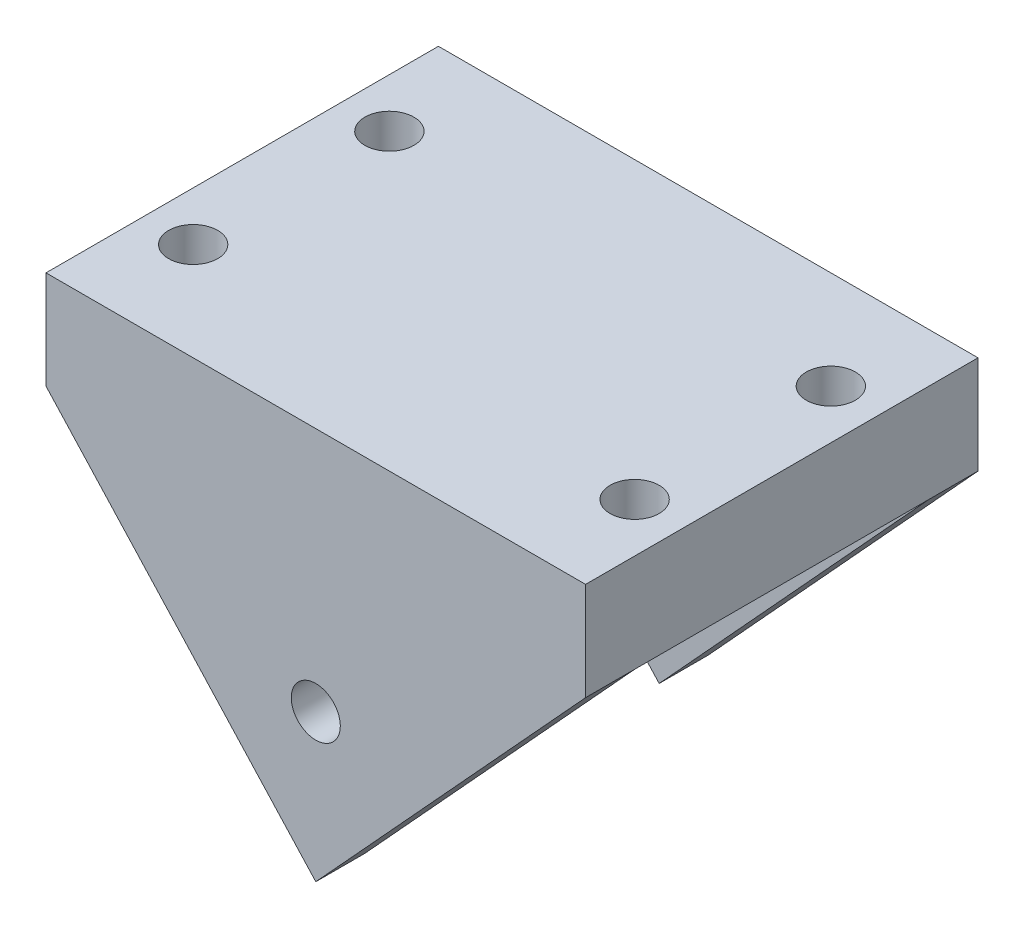
ISO-10303-21;
HEADER;
FILE_DESCRIPTION(('STEP AP214'),'2;1');
FILE_NAME('part.step','',(''),(''),'','','');
FILE_SCHEMA(('AUTOMOTIVE_DESIGN { 1 0 10303 214 1 1 1 1 }'));
ENDSEC;
DATA;
#1=APPLICATION_CONTEXT('core data for automotive mechanical design processes');
#2=APPLICATION_PROTOCOL_DEFINITION('international standard','automotive_design',2000,#1);
#3=PRODUCT_CONTEXT('',#1,'mechanical');
#4=PRODUCT('Part','Part','',(#3));
#5=PRODUCT_RELATED_PRODUCT_CATEGORY('part','',(#4));
#6=PRODUCT_DEFINITION_FORMATION('','',#4);
#7=PRODUCT_DEFINITION_CONTEXT('part definition',#1,'design');
#8=PRODUCT_DEFINITION('design','',#6,#7);
#9=PRODUCT_DEFINITION_SHAPE('','',#8);
#10=(LENGTH_UNIT() NAMED_UNIT(*) SI_UNIT(.MILLI.,.METRE.));
#11=(NAMED_UNIT(*) PLANE_ANGLE_UNIT() SI_UNIT($,.RADIAN.));
#12=(NAMED_UNIT(*) SI_UNIT($,.STERADIAN.) SOLID_ANGLE_UNIT());
#13=UNCERTAINTY_MEASURE_WITH_UNIT(LENGTH_MEASURE(1.E-05),#10,'distance_accuracy_value','');
#14=(GEOMETRIC_REPRESENTATION_CONTEXT(3) GLOBAL_UNCERTAINTY_ASSIGNED_CONTEXT((#13)) GLOBAL_UNIT_ASSIGNED_CONTEXT((#10,
#11,#12)) REPRESENTATION_CONTEXT('',''));
#15=CARTESIAN_POINT('',(0.,0.,0.));
#16=DIRECTION('',(0.,0.,1.));
#17=DIRECTION('',(1.,0.,0.));
#18=AXIS2_PLACEMENT_3D('',#15,#16,#17);
#19=CARTESIAN_POINT('',(55.,20.,-30.));
#20=DIRECTION('',(-1.,0.,0.));
#21=DIRECTION('',(0.,0.,1.));
#22=AXIS2_PLACEMENT_3D('',#19,#20,#21);
#23=PLANE('',#22);
#24=DIRECTION('',(0.,0.,-1.));
#25=VECTOR('',#24,1.);
#26=CARTESIAN_POINT('',(55.,0.,-30.));
#27=LINE('',#26,#25);
#28=CARTESIAN_POINT('',(55.,0.,30.));
#29=VERTEX_POINT('',#28);
#30=CARTESIAN_POINT('',(55.,0.,-30.));
#31=VERTEX_POINT('',#30);
#32=EDGE_CURVE('E228',#29,#31,#27,.T.);
#33=ORIENTED_EDGE('',*,*,#32,.T.);
#34=DIRECTION('',(0.,0.,1.));
#35=VECTOR('',#34,1.);
#36=CARTESIAN_POINT('',(55.,0.,-40.));
#37=LINE('',#36,#35);
#38=CARTESIAN_POINT('',(55.,0.,-40.));
#39=VERTEX_POINT('',#38);
#40=EDGE_CURVE('E161',#39,#31,#37,.T.);
#41=ORIENTED_EDGE('',*,*,#40,.F.);
#42=DIRECTION('',(0.,1.,0.));
#43=VECTOR('',#42,1.);
#44=CARTESIAN_POINT('',(55.,20.,-40.));
#45=LINE('',#44,#43);
#46=CARTESIAN_POINT('',(55.,20.,-40.));
#47=VERTEX_POINT('',#46);
#48=EDGE_CURVE('E135',#39,#47,#45,.T.);
#49=ORIENTED_EDGE('',*,*,#48,.T.);
#50=DIRECTION('',(0.,0.,-1.));
#51=VECTOR('',#50,1.);
#52=CARTESIAN_POINT('',(55.,20.,-30.));
#53=LINE('',#52,#51);
#54=CARTESIAN_POINT('',(55.,20.,40.));
#55=VERTEX_POINT('',#54);
#56=EDGE_CURVE('E54',#55,#47,#53,.T.);
#57=ORIENTED_EDGE('',*,*,#56,.F.);
#58=DIRECTION('',(0.,1.,0.));
#59=VECTOR('',#58,1.);
#60=CARTESIAN_POINT('',(55.,20.,40.));
#61=LINE('',#60,#59);
#62=CARTESIAN_POINT('',(55.,0.,40.));
#63=VERTEX_POINT('',#62);
#64=EDGE_CURVE('E175',#63,#55,#61,.T.);
#65=ORIENTED_EDGE('',*,*,#64,.F.);
#66=DIRECTION('',(0.,0.,-1.));
#67=VECTOR('',#66,1.);
#68=CARTESIAN_POINT('',(55.,0.,40.));
#69=LINE('',#68,#67);
#70=EDGE_CURVE('E182',#63,#29,#69,.T.);
#71=ORIENTED_EDGE('',*,*,#70,.T.);
#72=EDGE_LOOP('',(#33,#41,#49,#57,#65,#71));
#73=FACE_BOUND('',#72,.T.);
#74=ADVANCED_FACE('F45',(#73),#23,.F.);
#75=CARTESIAN_POINT('',(-55.,20.,-30.));
#76=DIRECTION('',(1.,0.,0.));
#77=DIRECTION('',(0.,0.,-1.));
#78=AXIS2_PLACEMENT_3D('',#75,#76,#77);
#79=PLANE('',#78);
#80=DIRECTION('',(0.,0.,1.));
#81=VECTOR('',#80,1.);
#82=CARTESIAN_POINT('',(-55.,0.,-30.));
#83=LINE('',#82,#81);
#84=CARTESIAN_POINT('',(-55.,0.,-30.));
#85=VERTEX_POINT('',#84);
#86=CARTESIAN_POINT('',(-55.,0.,30.));
#87=VERTEX_POINT('',#86);
#88=EDGE_CURVE('E62',#85,#87,#83,.T.);
#89=ORIENTED_EDGE('',*,*,#88,.T.);
#90=DIRECTION('',(0.,0.,-1.));
#91=VECTOR('',#90,1.);
#92=CARTESIAN_POINT('',(-55.,0.,40.));
#93=LINE('',#92,#91);
#94=CARTESIAN_POINT('',(-55.,0.,40.));
#95=VERTEX_POINT('',#94);
#96=EDGE_CURVE('E195',#95,#87,#93,.T.);
#97=ORIENTED_EDGE('',*,*,#96,.F.);
#98=DIRECTION('',(0.,-1.,0.));
#99=VECTOR('',#98,1.);
#100=CARTESIAN_POINT('',(-55.,0.,40.));
#101=LINE('',#100,#99);
#102=CARTESIAN_POINT('',(-55.,20.,40.));
#103=VERTEX_POINT('',#102);
#104=EDGE_CURVE('E116',#103,#95,#101,.T.);
#105=ORIENTED_EDGE('',*,*,#104,.F.);
#106=DIRECTION('',(0.,0.,1.));
#107=VECTOR('',#106,1.);
#108=CARTESIAN_POINT('',(-55.,20.,-30.));
#109=LINE('',#108,#107);
#110=CARTESIAN_POINT('',(-55.,20.,-40.));
#111=VERTEX_POINT('',#110);
#112=EDGE_CURVE('E11',#111,#103,#109,.T.);
#113=ORIENTED_EDGE('',*,*,#112,.F.);
#114=DIRECTION('',(0.,-1.,0.));
#115=VECTOR('',#114,1.);
#116=CARTESIAN_POINT('',(-55.,0.,-40.));
#117=LINE('',#116,#115);
#118=CARTESIAN_POINT('',(-55.,0.,-40.));
#119=VERTEX_POINT('',#118);
#120=EDGE_CURVE('E113',#111,#119,#117,.T.);
#121=ORIENTED_EDGE('',*,*,#120,.T.);
#122=DIRECTION('',(0.,0.,1.));
#123=VECTOR('',#122,1.);
#124=CARTESIAN_POINT('',(-55.,0.,-40.));
#125=LINE('',#124,#123);
#126=EDGE_CURVE('E147',#119,#85,#125,.T.);
#127=ORIENTED_EDGE('',*,*,#126,.T.);
#128=EDGE_LOOP('',(#89,#97,#105,#113,#121,#127));
#129=FACE_BOUND('',#128,.T.);
#130=ADVANCED_FACE('F112',(#129),#79,.F.);
#131=CARTESIAN_POINT('',(0.,20.,0.));
#132=DIRECTION('',(0.,1.,0.));
#133=DIRECTION('',(0.,0.,1.));
#134=AXIS2_PLACEMENT_3D('',#131,#132,#133);
#135=PLANE('',#134);
#136=CARTESIAN_POINT('',(-45.,20.,20.));
#137=DIRECTION('',(0.,1.,0.));
#138=DIRECTION('',(0.,0.,1.));
#139=AXIS2_PLACEMENT_3D('',#136,#137,#138);
#140=CIRCLE('',#139,5.);
#141=CARTESIAN_POINT('',(-45.,20.,25.));
#142=VERTEX_POINT('',#141);
#143=EDGE_CURVE('E217',#142,#142,#140,.T.);
#144=ORIENTED_EDGE('',*,*,#143,.F.);
#145=EDGE_LOOP('',(#144));
#146=FACE_BOUND('',#145,.T.);
#147=CARTESIAN_POINT('',(45.,20.,20.));
#148=DIRECTION('',(0.,1.,0.));
#149=DIRECTION('',(0.,0.,1.));
#150=AXIS2_PLACEMENT_3D('',#147,#148,#149);
#151=CIRCLE('',#150,5.);
#152=CARTESIAN_POINT('',(45.,20.,25.));
#153=VERTEX_POINT('',#152);
#154=EDGE_CURVE('E209',#153,#153,#151,.T.);
#155=ORIENTED_EDGE('',*,*,#154,.F.);
#156=EDGE_LOOP('',(#155));
#157=FACE_BOUND('',#156,.T.);
#158=CARTESIAN_POINT('',(45.,20.,-20.));
#159=DIRECTION('',(0.,1.,0.));
#160=DIRECTION('',(0.,0.,1.));
#161=AXIS2_PLACEMENT_3D('',#158,#159,#160);
#162=CIRCLE('',#161,5.);
#163=CARTESIAN_POINT('',(45.,20.,-15.));
#164=VERTEX_POINT('',#163);
#165=EDGE_CURVE('E200',#164,#164,#162,.T.);
#166=ORIENTED_EDGE('',*,*,#165,.F.);
#167=EDGE_LOOP('',(#166));
#168=FACE_BOUND('',#167,.T.);
#169=CARTESIAN_POINT('',(-45.,20.,-20.));
#170=DIRECTION('',(0.,1.,0.));
#171=DIRECTION('',(0.,0.,1.));
#172=AXIS2_PLACEMENT_3D('',#169,#170,#171);
#173=CIRCLE('',#172,5.);
#174=CARTESIAN_POINT('',(-45.,20.,-15.));
#175=VERTEX_POINT('',#174);
#176=EDGE_CURVE('E204',#175,#175,#173,.T.);
#177=ORIENTED_EDGE('',*,*,#176,.F.);
#178=EDGE_LOOP('',(#177));
#179=FACE_BOUND('',#178,.T.);
#180=ORIENTED_EDGE('',*,*,#56,.T.);
#181=DIRECTION('',(-1.,0.,0.));
#182=VECTOR('',#181,1.);
#183=CARTESIAN_POINT('',(-55.,20.,-40.));
#184=LINE('',#183,#182);
#185=EDGE_CURVE('E125',#47,#111,#184,.T.);
#186=ORIENTED_EDGE('',*,*,#185,.T.);
#187=ORIENTED_EDGE('',*,*,#112,.T.);
#188=DIRECTION('',(-1.,0.,0.));
#189=VECTOR('',#188,1.);
#190=CARTESIAN_POINT('',(-55.,20.,40.));
#191=LINE('',#190,#189);
#192=EDGE_CURVE('E179',#55,#103,#191,.T.);
#193=ORIENTED_EDGE('',*,*,#192,.F.);
#194=EDGE_LOOP('',(#180,#186,#187,#193));
#195=FACE_BOUND('',#194,.T.);
#196=ADVANCED_FACE('F133',(#146,#157,#168,#179,#195),#135,.T.);
#197=CARTESIAN_POINT('',(0.,0.,0.));
#198=DIRECTION('',(0.,1.,0.));
#199=DIRECTION('',(0.,0.,1.));
#200=AXIS2_PLACEMENT_3D('',#197,#198,#199);
#201=PLANE('',#200);
#202=ORIENTED_EDGE('',*,*,#32,.F.);
#203=DIRECTION('',(1.,0.,0.));
#204=VECTOR('',#203,1.);
#205=CARTESIAN_POINT('',(-55.,0.,30.));
#206=LINE('',#205,#204);
#207=EDGE_CURVE('E233',#87,#29,#206,.T.);
#208=ORIENTED_EDGE('',*,*,#207,.F.);
#209=ORIENTED_EDGE('',*,*,#88,.F.);
#210=DIRECTION('',(-1.,0.,0.));
#211=VECTOR('',#210,1.);
#212=CARTESIAN_POINT('',(-55.,0.,-30.));
#213=LINE('',#212,#211);
#214=EDGE_CURVE('E69',#31,#85,#213,.T.);
#215=ORIENTED_EDGE('',*,*,#214,.F.);
#216=EDGE_LOOP('',(#202,#208,#209,#215));
#217=FACE_BOUND('',#216,.T.);
#218=ADVANCED_FACE('F276',(#217),#201,.F.);
#219=CARTESIAN_POINT('',(-45.,10.,-20.));
#220=DIRECTION('',(0.,1.,0.));
#221=DIRECTION('',(0.,0.,1.));
#222=AXIS2_PLACEMENT_3D('',#219,#220,#221);
#223=CYLINDRICAL_SURFACE('',#222,5.);
#224=CARTESIAN_POINT('',(-45.,10.,-20.));
#225=DIRECTION('',(0.,1.,0.));
#226=DIRECTION('',(0.,0.,1.));
#227=AXIS2_PLACEMENT_3D('',#224,#225,#226);
#228=CIRCLE('',#227,5.);
#229=CARTESIAN_POINT('',(-45.,10.,-15.));
#230=VERTEX_POINT('',#229);
#231=EDGE_CURVE('E224',#230,#230,#228,.T.);
#232=ORIENTED_EDGE('',*,*,#231,.F.);
#233=EDGE_LOOP('',(#232));
#234=FACE_BOUND('',#233,.T.);
#235=ORIENTED_EDGE('',*,*,#176,.T.);
#236=EDGE_LOOP('',(#235));
#237=FACE_BOUND('',#236,.T.);
#238=ADVANCED_FACE('F281',(#234,#237),#223,.F.);
#239=CARTESIAN_POINT('',(-45.,10.,-20.));
#240=DIRECTION('',(0.,1.,0.));
#241=DIRECTION('',(0.,0.,1.));
#242=AXIS2_PLACEMENT_3D('',#239,#240,#241);
#243=PLANE('',#242);
#244=ORIENTED_EDGE('',*,*,#231,.T.);
#245=EDGE_LOOP('',(#244));
#246=FACE_BOUND('',#245,.T.);
#247=ADVANCED_FACE('F285',(#246),#243,.T.);
#248=CARTESIAN_POINT('',(45.,10.,-20.));
#249=DIRECTION('',(0.,1.,0.));
#250=DIRECTION('',(0.,0.,1.));
#251=AXIS2_PLACEMENT_3D('',#248,#249,#250);
#252=CYLINDRICAL_SURFACE('',#251,5.);
#253=CARTESIAN_POINT('',(45.,10.,-20.));
#254=DIRECTION('',(0.,1.,0.));
#255=DIRECTION('',(0.,0.,1.));
#256=AXIS2_PLACEMENT_3D('',#253,#254,#255);
#257=CIRCLE('',#256,5.);
#258=CARTESIAN_POINT('',(45.,10.,-15.));
#259=VERTEX_POINT('',#258);
#260=EDGE_CURVE('E205',#259,#259,#257,.T.);
#261=ORIENTED_EDGE('',*,*,#260,.F.);
#262=EDGE_LOOP('',(#261));
#263=FACE_BOUND('',#262,.T.);
#264=ORIENTED_EDGE('',*,*,#165,.T.);
#265=EDGE_LOOP('',(#264));
#266=FACE_BOUND('',#265,.T.);
#267=ADVANCED_FACE('F288',(#263,#266),#252,.F.);
#268=CARTESIAN_POINT('',(45.,10.,-20.));
#269=DIRECTION('',(0.,1.,0.));
#270=DIRECTION('',(0.,0.,1.));
#271=AXIS2_PLACEMENT_3D('',#268,#269,#270);
#272=PLANE('',#271);
#273=ORIENTED_EDGE('',*,*,#260,.T.);
#274=EDGE_LOOP('',(#273));
#275=FACE_BOUND('',#274,.T.);
#276=ADVANCED_FACE('F301',(#275),#272,.T.);
#277=CARTESIAN_POINT('',(45.,10.,20.));
#278=DIRECTION('',(0.,1.,0.));
#279=DIRECTION('',(0.,0.,1.));
#280=AXIS2_PLACEMENT_3D('',#277,#278,#279);
#281=CYLINDRICAL_SURFACE('',#280,5.);
#282=CARTESIAN_POINT('',(45.,10.,20.));
#283=DIRECTION('',(0.,1.,0.));
#284=DIRECTION('',(0.,0.,1.));
#285=AXIS2_PLACEMENT_3D('',#282,#283,#284);
#286=CIRCLE('',#285,5.);
#287=CARTESIAN_POINT('',(45.,10.,25.));
#288=VERTEX_POINT('',#287);
#289=EDGE_CURVE('E213',#288,#288,#286,.T.);
#290=ORIENTED_EDGE('',*,*,#289,.F.);
#291=EDGE_LOOP('',(#290));
#292=FACE_BOUND('',#291,.T.);
#293=ORIENTED_EDGE('',*,*,#154,.T.);
#294=EDGE_LOOP('',(#293));
#295=FACE_BOUND('',#294,.T.);
#296=ADVANCED_FACE('F297',(#292,#295),#281,.F.);
#297=CARTESIAN_POINT('',(45.,10.,20.));
#298=DIRECTION('',(0.,1.,0.));
#299=DIRECTION('',(0.,0.,1.));
#300=AXIS2_PLACEMENT_3D('',#297,#298,#299);
#301=PLANE('',#300);
#302=ORIENTED_EDGE('',*,*,#289,.T.);
#303=EDGE_LOOP('',(#302));
#304=FACE_BOUND('',#303,.T.);
#305=ADVANCED_FACE('F293',(#304),#301,.T.);
#306=CARTESIAN_POINT('',(-45.,10.,20.));
#307=DIRECTION('',(0.,1.,0.));
#308=DIRECTION('',(0.,0.,1.));
#309=AXIS2_PLACEMENT_3D('',#306,#307,#308);
#310=CYLINDRICAL_SURFACE('',#309,5.);
#311=CARTESIAN_POINT('',(-45.,10.,20.));
#312=DIRECTION('',(0.,1.,0.));
#313=DIRECTION('',(0.,0.,1.));
#314=AXIS2_PLACEMENT_3D('',#311,#312,#313);
#315=CIRCLE('',#314,5.);
#316=CARTESIAN_POINT('',(-45.,10.,25.));
#317=VERTEX_POINT('',#316);
#318=EDGE_CURVE('E199',#317,#317,#315,.T.);
#319=ORIENTED_EDGE('',*,*,#318,.F.);
#320=EDGE_LOOP('',(#319));
#321=FACE_BOUND('',#320,.T.);
#322=ORIENTED_EDGE('',*,*,#143,.T.);
#323=EDGE_LOOP('',(#322));
#324=FACE_BOUND('',#323,.T.);
#325=ADVANCED_FACE('F265',(#321,#324),#310,.F.);
#326=CARTESIAN_POINT('',(-45.,10.,20.));
#327=DIRECTION('',(0.,1.,0.));
#328=DIRECTION('',(0.,0.,1.));
#329=AXIS2_PLACEMENT_3D('',#326,#327,#328);
#330=PLANE('',#329);
#331=ORIENTED_EDGE('',*,*,#318,.T.);
#332=EDGE_LOOP('',(#331));
#333=FACE_BOUND('',#332,.T.);
#334=ADVANCED_FACE('F258',(#333),#330,.T.);
#335=CARTESIAN_POINT('',(-55.,0.,40.));
#336=DIRECTION('',(0.737154140200741,0.675724628517346,0.));
#337=DIRECTION('',(-0.675724628517346,0.737154140200741,0.));
#338=AXIS2_PLACEMENT_3D('',#335,#336,#337);
#339=PLANE('',#338);
#340=DIRECTION('',(0.675724628517346,-0.737154140200741,0.));
#341=VECTOR('',#340,1.);
#342=CARTESIAN_POINT('',(-55.,0.,30.));
#343=LINE('',#342,#341);
#344=CARTESIAN_POINT('',(0.,-60.,30.));
#345=VERTEX_POINT('',#344);
#346=EDGE_CURVE('E165',#87,#345,#343,.T.);
#347=ORIENTED_EDGE('',*,*,#346,.T.);
#348=DIRECTION('',(0.,0.,-1.));
#349=VECTOR('',#348,1.);
#350=CARTESIAN_POINT('',(0.,-60.,40.));
#351=LINE('',#350,#349);
#352=CARTESIAN_POINT('',(0.,-60.,40.));
#353=VERTEX_POINT('',#352);
#354=EDGE_CURVE('E191',#353,#345,#351,.T.);
#355=ORIENTED_EDGE('',*,*,#354,.F.);
#356=DIRECTION('',(0.675724628517346,-0.737154140200741,0.));
#357=VECTOR('',#356,1.);
#358=CARTESIAN_POINT('',(-55.,0.,40.));
#359=LINE('',#358,#357);
#360=EDGE_CURVE('E168',#95,#353,#359,.T.);
#361=ORIENTED_EDGE('',*,*,#360,.F.);
#362=ORIENTED_EDGE('',*,*,#96,.T.);
#363=EDGE_LOOP('',(#347,#355,#361,#362));
#364=FACE_BOUND('',#363,.T.);
#365=ADVANCED_FACE('F256',(#364),#339,.F.);
#366=CARTESIAN_POINT('',(0.,-60.,40.));
#367=DIRECTION('',(-0.737154140200741,0.675724628517346,0.));
#368=DIRECTION('',(-0.675724628517346,-0.737154140200741,0.));
#369=AXIS2_PLACEMENT_3D('',#366,#367,#368);
#370=PLANE('',#369);
#371=DIRECTION('',(0.675724628517346,0.737154140200741,0.));
#372=VECTOR('',#371,1.);
#373=CARTESIAN_POINT('',(0.,-60.,30.));
#374=LINE('',#373,#372);
#375=EDGE_CURVE('E169',#345,#29,#374,.T.);
#376=ORIENTED_EDGE('',*,*,#375,.T.);
#377=ORIENTED_EDGE('',*,*,#70,.F.);
#378=DIRECTION('',(0.675724628517346,0.737154140200741,0.));
#379=VECTOR('',#378,1.);
#380=CARTESIAN_POINT('',(0.,-60.,40.));
#381=LINE('',#380,#379);
#382=EDGE_CURVE('E172',#353,#63,#381,.T.);
#383=ORIENTED_EDGE('',*,*,#382,.F.);
#384=ORIENTED_EDGE('',*,*,#354,.T.);
#385=EDGE_LOOP('',(#376,#377,#383,#384));
#386=FACE_BOUND('',#385,.T.);
#387=ADVANCED_FACE('F248',(#386),#370,.F.);
#388=CARTESIAN_POINT('',(0.,0.,40.));
#389=DIRECTION('',(0.,0.,-1.));
#390=DIRECTION('',(-1.,0.,0.));
#391=AXIS2_PLACEMENT_3D('',#388,#389,#390);
#392=PLANE('',#391);
#393=CARTESIAN_POINT('',(0.,-30.,40.));
#394=DIRECTION('',(0.,0.,1.));
#395=DIRECTION('',(1.,0.,0.));
#396=AXIS2_PLACEMENT_3D('',#393,#394,#395);
#397=CIRCLE('',#396,5.);
#398=CARTESIAN_POINT('',(5.,-30.,40.));
#399=VERTEX_POINT('',#398);
#400=EDGE_CURVE('E494',#399,#399,#397,.T.);
#401=ORIENTED_EDGE('',*,*,#400,.F.);
#402=EDGE_LOOP('',(#401));
#403=FACE_BOUND('',#402,.T.);
#404=ORIENTED_EDGE('',*,*,#104,.T.);
#405=ORIENTED_EDGE('',*,*,#360,.T.);
#406=ORIENTED_EDGE('',*,*,#382,.T.);
#407=ORIENTED_EDGE('',*,*,#64,.T.);
#408=ORIENTED_EDGE('',*,*,#192,.T.);
#409=EDGE_LOOP('',(#404,#405,#406,#407,#408));
#410=FACE_BOUND('',#409,.T.);
#411=ADVANCED_FACE('F254',(#403,#410),#392,.F.);
#412=CARTESIAN_POINT('',(0.,0.,30.));
#413=DIRECTION('',(0.,0.,-1.));
#414=DIRECTION('',(-1.,0.,0.));
#415=AXIS2_PLACEMENT_3D('',#412,#413,#414);
#416=PLANE('',#415);
#417=CARTESIAN_POINT('',(0.,-30.,30.));
#418=DIRECTION('',(0.,0.,-1.));
#419=DIRECTION('',(-1.,0.,0.));
#420=AXIS2_PLACEMENT_3D('',#417,#418,#419);
#421=CIRCLE('',#420,5.);
#422=CARTESIAN_POINT('',(-5.,-30.,30.));
#423=VERTEX_POINT('',#422);
#424=EDGE_CURVE('E152',#423,#423,#421,.T.);
#425=ORIENTED_EDGE('',*,*,#424,.F.);
#426=EDGE_LOOP('',(#425));
#427=FACE_BOUND('',#426,.T.);
#428=ORIENTED_EDGE('',*,*,#346,.F.);
#429=ORIENTED_EDGE('',*,*,#207,.T.);
#430=ORIENTED_EDGE('',*,*,#375,.F.);
#431=EDGE_LOOP('',(#428,#429,#430));
#432=FACE_BOUND('',#431,.T.);
#433=ADVANCED_FACE('F245',(#427,#432),#416,.T.);
#434=CARTESIAN_POINT('',(0.,-60.,-40.));
#435=DIRECTION('',(0.737154140200741,-0.675724628517346,0.));
#436=DIRECTION('',(0.675724628517346,0.737154140200741,0.));
#437=AXIS2_PLACEMENT_3D('',#434,#435,#436);
#438=PLANE('',#437);
#439=DIRECTION('',(0.675724628517346,0.737154140200741,0.));
#440=VECTOR('',#439,1.);
#441=CARTESIAN_POINT('',(0.,-60.,-30.));
#442=LINE('',#441,#440);
#443=CARTESIAN_POINT('',(0.,-60.,-30.));
#444=VERTEX_POINT('',#443);
#445=EDGE_CURVE('E148',#444,#31,#442,.T.);
#446=ORIENTED_EDGE('',*,*,#445,.F.);
#447=DIRECTION('',(0.,0.,1.));
#448=VECTOR('',#447,1.);
#449=CARTESIAN_POINT('',(0.,-60.,-40.));
#450=LINE('',#449,#448);
#451=CARTESIAN_POINT('',(0.,-60.,-40.));
#452=VERTEX_POINT('',#451);
#453=EDGE_CURVE('E158',#452,#444,#450,.T.);
#454=ORIENTED_EDGE('',*,*,#453,.F.);
#455=DIRECTION('',(0.675724628517346,0.737154140200741,0.));
#456=VECTOR('',#455,1.);
#457=CARTESIAN_POINT('',(0.,-60.,-40.));
#458=LINE('',#457,#456);
#459=EDGE_CURVE('E138',#452,#39,#458,.T.);
#460=ORIENTED_EDGE('',*,*,#459,.T.);
#461=ORIENTED_EDGE('',*,*,#40,.T.);
#462=EDGE_LOOP('',(#446,#454,#460,#461));
#463=FACE_BOUND('',#462,.T.);
#464=ADVANCED_FACE('F402',(#463),#438,.T.);
#465=CARTESIAN_POINT('',(-55.,0.,-40.));
#466=DIRECTION('',(-0.737154140200741,-0.675724628517346,0.));
#467=DIRECTION('',(0.675724628517346,-0.737154140200741,0.));
#468=AXIS2_PLACEMENT_3D('',#465,#466,#467);
#469=PLANE('',#468);
#470=DIRECTION('',(0.675724628517346,-0.737154140200741,0.));
#471=VECTOR('',#470,1.);
#472=CARTESIAN_POINT('',(-55.,0.,-30.));
#473=LINE('',#472,#471);
#474=EDGE_CURVE('E131',#85,#444,#473,.T.);
#475=ORIENTED_EDGE('',*,*,#474,.F.);
#476=ORIENTED_EDGE('',*,*,#126,.F.);
#477=DIRECTION('',(0.675724628517346,-0.737154140200741,0.));
#478=VECTOR('',#477,1.);
#479=CARTESIAN_POINT('',(-55.,0.,-40.));
#480=LINE('',#479,#478);
#481=EDGE_CURVE('E129',#119,#452,#480,.T.);
#482=ORIENTED_EDGE('',*,*,#481,.T.);
#483=ORIENTED_EDGE('',*,*,#453,.T.);
#484=EDGE_LOOP('',(#475,#476,#482,#483));
#485=FACE_BOUND('',#484,.T.);
#486=ADVANCED_FACE('F413',(#485),#469,.T.);
#487=CARTESIAN_POINT('',(0.,0.,-40.));
#488=DIRECTION('',(0.,0.,1.));
#489=DIRECTION('',(-1.,0.,0.));
#490=AXIS2_PLACEMENT_3D('',#487,#488,#489);
#491=PLANE('',#490);
#492=CARTESIAN_POINT('',(0.,-30.,-40.));
#493=DIRECTION('',(0.,0.,1.));
#494=DIRECTION('',(1.,0.,0.));
#495=AXIS2_PLACEMENT_3D('',#492,#493,#494);
#496=CIRCLE('',#495,5.);
#497=CARTESIAN_POINT('',(5.,-30.,-40.));
#498=VERTEX_POINT('',#497);
#499=EDGE_CURVE('E496',#498,#498,#496,.T.);
#500=ORIENTED_EDGE('',*,*,#499,.T.);
#501=EDGE_LOOP('',(#500));
#502=FACE_BOUND('',#501,.T.);
#503=ORIENTED_EDGE('',*,*,#120,.F.);
#504=ORIENTED_EDGE('',*,*,#185,.F.);
#505=ORIENTED_EDGE('',*,*,#48,.F.);
#506=ORIENTED_EDGE('',*,*,#459,.F.);
#507=ORIENTED_EDGE('',*,*,#481,.F.);
#508=EDGE_LOOP('',(#503,#504,#505,#506,#507));
#509=FACE_BOUND('',#508,.T.);
#510=ADVANCED_FACE('F123',(#502,#509),#491,.F.);
#511=CARTESIAN_POINT('',(0.,0.,-30.));
#512=DIRECTION('',(0.,0.,1.));
#513=DIRECTION('',(-1.,0.,0.));
#514=AXIS2_PLACEMENT_3D('',#511,#512,#513);
#515=PLANE('',#514);
#516=CARTESIAN_POINT('',(0.,-30.,-30.));
#517=DIRECTION('',(0.,0.,1.));
#518=DIRECTION('',(1.,0.,0.));
#519=AXIS2_PLACEMENT_3D('',#516,#517,#518);
#520=CIRCLE('',#519,5.);
#521=CARTESIAN_POINT('',(5.,-30.,-30.));
#522=VERTEX_POINT('',#521);
#523=EDGE_CURVE('E48',#522,#522,#520,.T.);
#524=ORIENTED_EDGE('',*,*,#523,.F.);
#525=EDGE_LOOP('',(#524));
#526=FACE_BOUND('',#525,.T.);
#527=ORIENTED_EDGE('',*,*,#445,.T.);
#528=ORIENTED_EDGE('',*,*,#214,.T.);
#529=ORIENTED_EDGE('',*,*,#474,.T.);
#530=EDGE_LOOP('',(#527,#528,#529));
#531=FACE_BOUND('',#530,.T.);
#532=ADVANCED_FACE('F412',(#526,#531),#515,.T.);
#533=CARTESIAN_POINT('',(0.,-30.,-40.));
#534=DIRECTION('',(0.,0.,1.));
#535=DIRECTION('',(1.,0.,0.));
#536=AXIS2_PLACEMENT_3D('',#533,#534,#535);
#537=CYLINDRICAL_SURFACE('',#536,5.);
#538=ORIENTED_EDGE('',*,*,#523,.T.);
#539=EDGE_LOOP('',(#538));
#540=FACE_BOUND('',#539,.T.);
#541=ORIENTED_EDGE('',*,*,#499,.F.);
#542=EDGE_LOOP('',(#541));
#543=FACE_BOUND('',#542,.T.);
#544=ADVANCED_FACE('F423',(#540,#543),#537,.F.);
#545=ORIENTED_EDGE('',*,*,#424,.T.);
#546=EDGE_LOOP('',(#545));
#547=FACE_BOUND('',#546,.T.);
#548=ORIENTED_EDGE('',*,*,#400,.T.);
#549=EDGE_LOOP('',(#548));
#550=FACE_BOUND('',#549,.T.);
#551=ADVANCED_FACE('F432',(#547,#550),#537,.F.);
#552=CLOSED_SHELL('',(#74,#130,#196,#218,#238,#247,#267,#276,#296,#305,#325,#334,#365,#387,#411,
#433,#464,#486,#510,#532,#544,#551));
#553=MANIFOLD_SOLID_BREP('B2',#552);
#554=ADVANCED_BREP_SHAPE_REPRESENTATION('',(#18,#553),#14);
#555=SHAPE_DEFINITION_REPRESENTATION(#9,#554);
ENDSEC;
END-ISO-10303-21;
